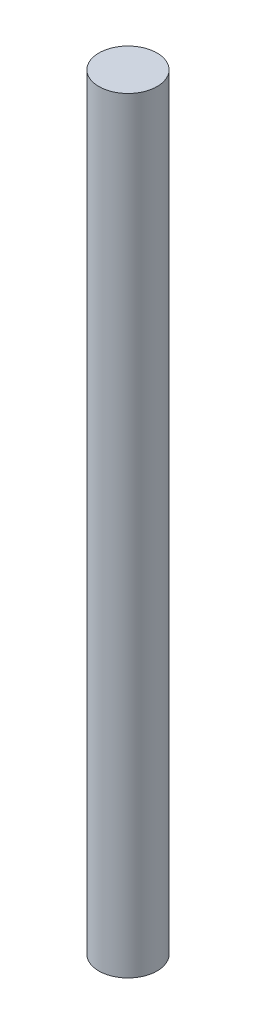
ISO-10303-21;
HEADER;
FILE_DESCRIPTION(('STEP AP214'),'2;1');
FILE_NAME('part.step','',(''),(''),'','','');
FILE_SCHEMA(('AUTOMOTIVE_DESIGN { 1 0 10303 214 1 1 1 1 }'));
ENDSEC;
DATA;
#1=APPLICATION_CONTEXT('core data for automotive mechanical design processes');
#2=APPLICATION_PROTOCOL_DEFINITION('international standard','automotive_design',2000,#1);
#3=PRODUCT_CONTEXT('',#1,'mechanical');
#4=PRODUCT('Part','Part','',(#3));
#5=PRODUCT_RELATED_PRODUCT_CATEGORY('part','',(#4));
#6=PRODUCT_DEFINITION_FORMATION('','',#4);
#7=PRODUCT_DEFINITION_CONTEXT('part definition',#1,'design');
#8=PRODUCT_DEFINITION('design','',#6,#7);
#9=PRODUCT_DEFINITION_SHAPE('','',#8);
#10=(LENGTH_UNIT() NAMED_UNIT(*) SI_UNIT(.MILLI.,.METRE.));
#11=(NAMED_UNIT(*) PLANE_ANGLE_UNIT() SI_UNIT($,.RADIAN.));
#12=(NAMED_UNIT(*) SI_UNIT($,.STERADIAN.) SOLID_ANGLE_UNIT());
#13=UNCERTAINTY_MEASURE_WITH_UNIT(LENGTH_MEASURE(1.E-05),#10,'distance_accuracy_value','');
#14=(GEOMETRIC_REPRESENTATION_CONTEXT(3) GLOBAL_UNCERTAINTY_ASSIGNED_CONTEXT((#13)) GLOBAL_UNIT_ASSIGNED_CONTEXT((#10,
#11,#12)) REPRESENTATION_CONTEXT('',''));
#15=CARTESIAN_POINT('',(0.,0.,0.));
#16=DIRECTION('',(0.,0.,1.));
#17=DIRECTION('',(1.,0.,0.));
#18=AXIS2_PLACEMENT_3D('',#15,#16,#17);
#19=CARTESIAN_POINT('',(0.,79.,0.));
#20=DIRECTION('',(0.,-1.,0.));
#21=DIRECTION('',(0.,0.,-1.));
#22=AXIS2_PLACEMENT_3D('',#19,#20,#21);
#23=CYLINDRICAL_SURFACE('',#22,3.);
#24=CARTESIAN_POINT('',(0.,79.,0.));
#25=DIRECTION('',(0.,1.,0.));
#26=DIRECTION('',(0.,0.,1.));
#27=AXIS2_PLACEMENT_3D('',#24,#25,#26);
#28=CIRCLE('',#27,3.);
#29=CARTESIAN_POINT('',(0.,79.,3.));
#30=VERTEX_POINT('',#29);
#31=EDGE_CURVE('E10',#30,#30,#28,.T.);
#32=ORIENTED_EDGE('',*,*,#31,.F.);
#33=EDGE_LOOP('',(#32));
#34=FACE_BOUND('',#33,.T.);
#35=CARTESIAN_POINT('',(0.,0.,0.));
#36=DIRECTION('',(0.,1.,0.));
#37=DIRECTION('',(0.,0.,1.));
#38=AXIS2_PLACEMENT_3D('',#35,#36,#37);
#39=CIRCLE('',#38,3.);
#40=CARTESIAN_POINT('',(0.,0.,3.));
#41=VERTEX_POINT('',#40);
#42=EDGE_CURVE('E46',#41,#41,#39,.T.);
#43=ORIENTED_EDGE('',*,*,#42,.T.);
#44=EDGE_LOOP('',(#43));
#45=FACE_BOUND('',#44,.T.);
#46=ADVANCED_FACE('F43',(#34,#45),#23,.T.);
#47=CARTESIAN_POINT('',(0.,79.,0.));
#48=DIRECTION('',(0.,1.,0.));
#49=DIRECTION('',(0.,0.,1.));
#50=AXIS2_PLACEMENT_3D('',#47,#48,#49);
#51=PLANE('',#50);
#52=ORIENTED_EDGE('',*,*,#31,.T.);
#53=EDGE_LOOP('',(#52));
#54=FACE_BOUND('',#53,.T.);
#55=ADVANCED_FACE('F60',(#54),#51,.T.);
#56=CARTESIAN_POINT('',(0.,0.,0.));
#57=DIRECTION('',(0.,1.,0.));
#58=DIRECTION('',(0.,0.,1.));
#59=AXIS2_PLACEMENT_3D('',#56,#57,#58);
#60=PLANE('',#59);
#61=ORIENTED_EDGE('',*,*,#42,.F.);
#62=EDGE_LOOP('',(#61));
#63=FACE_BOUND('',#62,.T.);
#64=ADVANCED_FACE('F58',(#63),#60,.F.);
#65=CLOSED_SHELL('',(#46,#55,#64));
#66=MANIFOLD_SOLID_BREP('B2',#65);
#67=ADVANCED_BREP_SHAPE_REPRESENTATION('',(#18,#66),#14);
#68=SHAPE_DEFINITION_REPRESENTATION(#9,#67);
ENDSEC;
END-ISO-10303-21;
